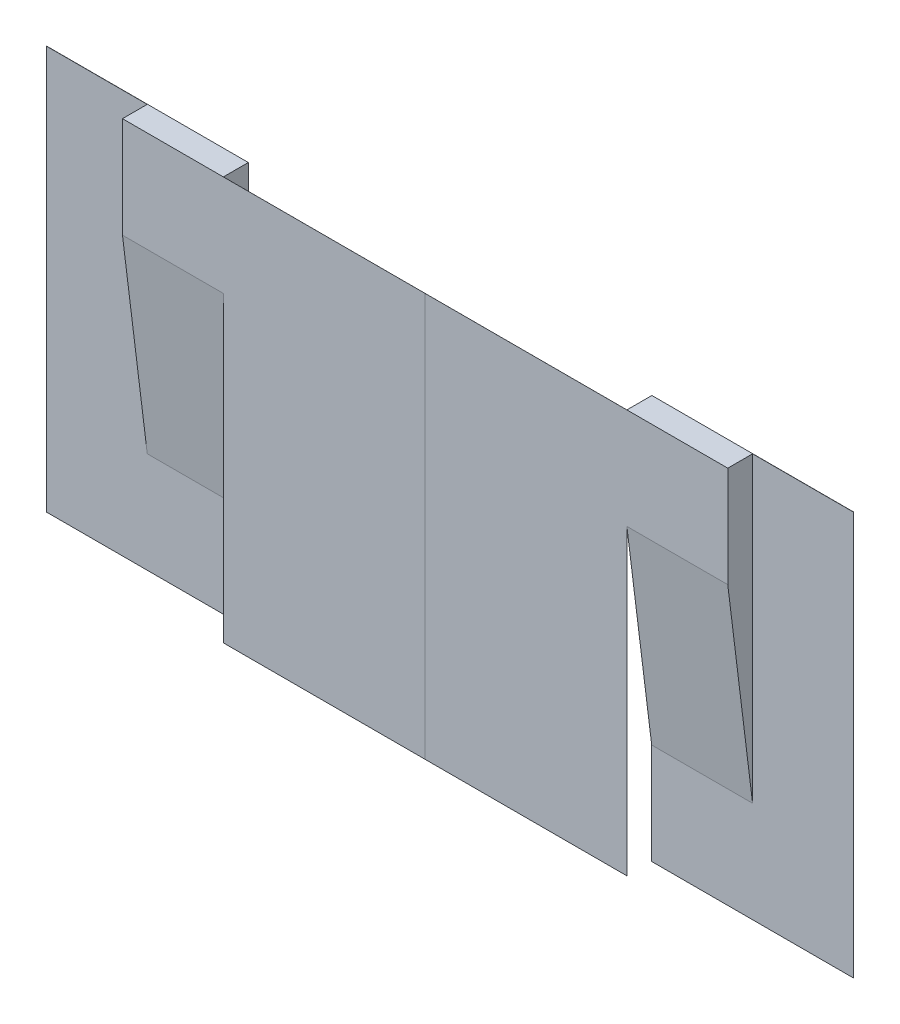
ISO-10303-21;
HEADER;
FILE_DESCRIPTION(('STEP AP214'),'2;1');
FILE_NAME('part.step','',(''),(''),'','','');
FILE_SCHEMA(('AUTOMOTIVE_DESIGN { 1 0 10303 214 1 1 1 1 }'));
ENDSEC;
DATA;
#1=APPLICATION_CONTEXT('core data for automotive mechanical design processes');
#2=APPLICATION_PROTOCOL_DEFINITION('international standard','automotive_design',2000,#1);
#3=PRODUCT_CONTEXT('',#1,'mechanical');
#4=PRODUCT('Part','Part','',(#3));
#5=PRODUCT_RELATED_PRODUCT_CATEGORY('part','',(#4));
#6=PRODUCT_DEFINITION_FORMATION('','',#4);
#7=PRODUCT_DEFINITION_CONTEXT('part definition',#1,'design');
#8=PRODUCT_DEFINITION('design','',#6,#7);
#9=PRODUCT_DEFINITION_SHAPE('','',#8);
#10=(LENGTH_UNIT() NAMED_UNIT(*) SI_UNIT(.MILLI.,.METRE.));
#11=(NAMED_UNIT(*) PLANE_ANGLE_UNIT() SI_UNIT($,.RADIAN.));
#12=(NAMED_UNIT(*) SI_UNIT($,.STERADIAN.) SOLID_ANGLE_UNIT());
#13=UNCERTAINTY_MEASURE_WITH_UNIT(LENGTH_MEASURE(1.E-05),#10,'distance_accuracy_value','');
#14=(GEOMETRIC_REPRESENTATION_CONTEXT(3) GLOBAL_UNCERTAINTY_ASSIGNED_CONTEXT((#13)) GLOBAL_UNIT_ASSIGNED_CONTEXT((#10,
#11,#12)) REPRESENTATION_CONTEXT('',''));
#15=CARTESIAN_POINT('',(0.,0.,0.));
#16=DIRECTION('',(0.,0.,1.));
#17=DIRECTION('',(1.,0.,0.));
#18=AXIS2_PLACEMENT_3D('',#15,#16,#17);
#19=CARTESIAN_POINT('',(-305.,-376.820483207703,-349.609273672104));
#20=DIRECTION('',(1.,0.,0.));
#21=DIRECTION('',(0.,1.,0.));
#22=AXIS2_PLACEMENT_3D('',#19,#20,#21);
#23=PLANE('',#22);
#24=DIRECTION('',(0.,-1.,0.));
#25=VECTOR('',#24,1.);
#26=CARTESIAN_POINT('',(-305.,-376.820483207703,-274.709273672104));
#27=LINE('',#26,#25);
#28=CARTESIAN_POINT('',(-305.,538.179516792297,-274.709273672104));
#29=VERTEX_POINT('',#28);
#30=CARTESIAN_POINT('',(-305.,-72.6338165410332,-274.709273672104));
#31=VERTEX_POINT('',#30);
#32=EDGE_CURVE('E21',#29,#31,#27,.T.);
#33=ORIENTED_EDGE('',*,*,#32,.F.);
#34=DIRECTION('',(0.,0.,1.));
#35=VECTOR('',#34,1.);
#36=CARTESIAN_POINT('',(-305.,538.179516792297,-349.609273672104));
#37=LINE('',#36,#35);
#38=CARTESIAN_POINT('',(-305.,538.179516792297,-425.609273672104));
#39=VERTEX_POINT('',#38);
#40=EDGE_CURVE('E339',#39,#29,#37,.T.);
#41=ORIENTED_EDGE('',*,*,#40,.F.);
#42=DIRECTION('',(0.,1.,0.));
#43=VECTOR('',#42,1.);
#44=CARTESIAN_POINT('',(-305.,-376.820483207703,-425.609273672104));
#45=LINE('',#44,#43);
#46=CARTESIAN_POINT('',(-305.,-1901.82048320771,-425.609273672104));
#47=VERTEX_POINT('',#46);
#48=EDGE_CURVE('E295',#47,#39,#45,.T.);
#49=ORIENTED_EDGE('',*,*,#48,.F.);
#50=DIRECTION('',(0.,0.,1.));
#51=VECTOR('',#50,1.);
#52=CARTESIAN_POINT('',(-305.,-1901.82048320771,-425.609273672104));
#53=LINE('',#52,#51);
#54=CARTESIAN_POINT('',(-305.,-1901.82048320771,-424.609273672104));
#55=VERTEX_POINT('',#54);
#56=EDGE_CURVE('E326',#47,#55,#53,.T.);
#57=ORIENTED_EDGE('',*,*,#56,.T.);
#58=DIRECTION('',(0.,1.,0.));
#59=VECTOR('',#58,1.);
#60=CARTESIAN_POINT('',(-305.,-376.820483207703,-424.609273672104));
#61=LINE('',#60,#59);
#62=CARTESIAN_POINT('',(-305.,-1291.8204832077,-424.609273672104));
#63=VERTEX_POINT('',#62);
#64=EDGE_CURVE('E294',#55,#63,#61,.T.);
#65=ORIENTED_EDGE('',*,*,#64,.T.);
#66=DIRECTION('',(0.,-0.992526177814719,-0.122031907108367));
#67=VECTOR('',#66,1.);
#68=CARTESIAN_POINT('',(-305.,-681.820483207701,-349.609273672104));
#69=LINE('',#68,#67);
#70=EDGE_CURVE('E329',#31,#63,#69,.T.);
#71=ORIENTED_EDGE('',*,*,#70,.F.);
#72=EDGE_LOOP('',(#33,#41,#49,#57,#65,#71));
#73=FACE_BOUND('',#72,.T.);
#74=ADVANCED_FACE('F17',(#73),#23,.F.);
#75=CARTESIAN_POINT('',(305.,-681.820483207701,-349.609273672104));
#76=DIRECTION('',(0.,0.122031907108367,-0.992526177814719));
#77=DIRECTION('',(0.,0.992526177814719,0.122031907108367));
#78=AXIS2_PLACEMENT_3D('',#75,#76,#77);
#79=PLANE('',#78);
#80=CARTESIAN_POINT('',(-305.,-71.8204832077005,-274.609273672104));
#81=VERTEX_POINT('',#80);
#82=EDGE_CURVE('E347',#81,#31,#69,.T.);
#83=ORIENTED_EDGE('',*,*,#82,.T.);
#84=ORIENTED_EDGE('',*,*,#70,.T.);
#85=DIRECTION('',(-1.,0.,0.));
#86=VECTOR('',#85,1.);
#87=CARTESIAN_POINT('',(305.,-1291.8204832077,-424.609273672104));
#88=LINE('',#87,#86);
#89=CARTESIAN_POINT('',(305.,-1291.8204832077,-424.609273672104));
#90=VERTEX_POINT('',#89);
#91=EDGE_CURVE('E358',#90,#63,#88,.T.);
#92=ORIENTED_EDGE('',*,*,#91,.F.);
#93=DIRECTION('',(0.,-0.992526177814719,-0.122031907108367));
#94=VECTOR('',#93,1.);
#95=CARTESIAN_POINT('',(305.,-681.820483207701,-349.609273672104));
#96=LINE('',#95,#94);
#97=CARTESIAN_POINT('',(305.,-71.8204832077005,-274.609273672104));
#98=VERTEX_POINT('',#97);
#99=EDGE_CURVE('E335',#98,#90,#96,.T.);
#100=ORIENTED_EDGE('',*,*,#99,.F.);
#101=DIRECTION('',(-1.,0.,0.));
#102=VECTOR('',#101,1.);
#103=CARTESIAN_POINT('',(305.,-71.8204832077005,-274.609273672104));
#104=LINE('',#103,#102);
#105=EDGE_CURVE('E346',#98,#81,#104,.T.);
#106=ORIENTED_EDGE('',*,*,#105,.T.);
#107=EDGE_LOOP('',(#83,#84,#92,#100,#106));
#108=FACE_BOUND('',#107,.T.);
#109=ADVANCED_FACE('F19',(#108),#79,.F.);
#110=CARTESIAN_POINT('',(305.,538.179516792297,-349.609273672104));
#111=DIRECTION('',(0.,-1.,0.));
#112=DIRECTION('',(0.,0.,-1.));
#113=AXIS2_PLACEMENT_3D('',#110,#111,#112);
#114=PLANE('',#113);
#115=ORIENTED_EDGE('',*,*,#40,.T.);
#116=DIRECTION('',(-1.,0.,0.));
#117=VECTOR('',#116,1.);
#118=CARTESIAN_POINT('',(-915.,538.179516792297,-274.709273672104));
#119=LINE('',#118,#117);
#120=CARTESIAN_POINT('',(-1525.,538.179516792298,-274.709273672104));
#121=VERTEX_POINT('',#120);
#122=EDGE_CURVE('E258',#29,#121,#119,.T.);
#123=ORIENTED_EDGE('',*,*,#122,.T.);
#124=DIRECTION('',(0.,0.,1.));
#125=VECTOR('',#124,1.);
#126=CARTESIAN_POINT('',(-1525.,538.179516792298,-274.709273672104));
#127=LINE('',#126,#125);
#128=CARTESIAN_POINT('',(-1525.,538.179516792298,-274.609273672104));
#129=VERTEX_POINT('',#128);
#130=EDGE_CURVE('E290',#121,#129,#127,.T.);
#131=ORIENTED_EDGE('',*,*,#130,.T.);
#132=DIRECTION('',(-1.,0.,0.));
#133=VECTOR('',#132,1.);
#134=CARTESIAN_POINT('',(305.,538.179516792297,-274.609273672104));
#135=LINE('',#134,#133);
#136=CARTESIAN_POINT('',(305.,538.179516792297,-274.609273672104));
#137=VERTEX_POINT('',#136);
#138=EDGE_CURVE('E356',#137,#129,#135,.T.);
#139=ORIENTED_EDGE('',*,*,#138,.F.);
#140=DIRECTION('',(0.,0.,1.));
#141=VECTOR('',#140,1.);
#142=CARTESIAN_POINT('',(305.,538.179516792297,-349.609273672104));
#143=LINE('',#142,#141);
#144=CARTESIAN_POINT('',(305.,538.179516792297,-424.609273672104));
#145=VERTEX_POINT('',#144);
#146=EDGE_CURVE('E45',#145,#137,#143,.T.);
#147=ORIENTED_EDGE('',*,*,#146,.F.);
#148=DIRECTION('',(-1.,0.,0.));
#149=VECTOR('',#148,1.);
#150=CARTESIAN_POINT('',(305.,538.179516792297,-424.609273672104));
#151=LINE('',#150,#149);
#152=CARTESIAN_POINT('',(915.,538.179516792297,-424.609273672104));
#153=VERTEX_POINT('',#152);
#154=EDGE_CURVE('E315',#153,#145,#151,.T.);
#155=ORIENTED_EDGE('',*,*,#154,.F.);
#156=DIRECTION('',(0.,0.,1.));
#157=VECTOR('',#156,1.);
#158=CARTESIAN_POINT('',(915.,538.179516792297,-425.609273672104));
#159=LINE('',#158,#157);
#160=CARTESIAN_POINT('',(915.,538.179516792297,-425.609273672104));
#161=VERTEX_POINT('',#160);
#162=EDGE_CURVE('E330',#161,#153,#159,.T.);
#163=ORIENTED_EDGE('',*,*,#162,.F.);
#164=DIRECTION('',(-1.,0.,0.));
#165=VECTOR('',#164,1.);
#166=CARTESIAN_POINT('',(305.,538.179516792297,-425.609273672104));
#167=LINE('',#166,#165);
#168=EDGE_CURVE('E299',#161,#39,#167,.T.);
#169=ORIENTED_EDGE('',*,*,#168,.T.);
#170=EDGE_LOOP('',(#115,#123,#131,#139,#147,#155,#163,#169));
#171=FACE_BOUND('',#170,.T.);
#172=ADVANCED_FACE('F392',(#171),#114,.F.);
#173=CARTESIAN_POINT('',(305.,233.179516792298,-274.609273672104));
#174=DIRECTION('',(0.,0.,-1.));
#175=DIRECTION('',(0.,1.,0.));
#176=AXIS2_PLACEMENT_3D('',#173,#174,#175);
#177=PLANE('',#176);
#178=DIRECTION('',(0.,-1.,0.));
#179=VECTOR('',#178,1.);
#180=CARTESIAN_POINT('',(-305.,-822.701977826655,-274.609273672104));
#181=LINE('',#180,#179);
#182=CARTESIAN_POINT('',(-305.,-1901.8204832077,-274.609273672104));
#183=VERTEX_POINT('',#182);
#184=EDGE_CURVE('E263',#81,#183,#181,.T.);
#185=ORIENTED_EDGE('',*,*,#184,.F.);
#186=ORIENTED_EDGE('',*,*,#105,.F.);
#187=DIRECTION('',(0.,-1.,0.));
#188=VECTOR('',#187,1.);
#189=CARTESIAN_POINT('',(305.,233.179516792298,-274.609273672104));
#190=LINE('',#189,#188);
#191=EDGE_CURVE('E39',#137,#98,#190,.T.);
#192=ORIENTED_EDGE('',*,*,#191,.F.);
#193=ORIENTED_EDGE('',*,*,#138,.T.);
#194=DIRECTION('',(0.,-1.,0.));
#195=VECTOR('',#194,1.);
#196=CARTESIAN_POINT('',(-1525.,-681.820483207702,-274.609273672104));
#197=LINE('',#196,#195);
#198=CARTESIAN_POINT('',(-1525.,-1901.8204832077,-274.609273672104));
#199=VERTEX_POINT('',#198);
#200=EDGE_CURVE('E251',#129,#199,#197,.T.);
#201=ORIENTED_EDGE('',*,*,#200,.T.);
#202=DIRECTION('',(-1.,0.,0.));
#203=VECTOR('',#202,1.);
#204=CARTESIAN_POINT('',(-915.,-1901.8204832077,-274.609273672104));
#205=LINE('',#204,#203);
#206=EDGE_CURVE('E278',#183,#199,#205,.T.);
#207=ORIENTED_EDGE('',*,*,#206,.F.);
#208=EDGE_LOOP('',(#185,#186,#192,#193,#201,#207));
#209=FACE_BOUND('',#208,.T.);
#210=ADVANCED_FACE('F384',(#209),#177,.F.);
#211=CARTESIAN_POINT('',(305.,-376.820483207703,-349.609273672104));
#212=DIRECTION('',(1.,0.,0.));
#213=DIRECTION('',(0.,1.,0.));
#214=AXIS2_PLACEMENT_3D('',#211,#212,#213);
#215=PLANE('',#214);
#216=ORIENTED_EDGE('',*,*,#99,.T.);
#217=DIRECTION('',(0.,1.,0.));
#218=VECTOR('',#217,1.);
#219=CARTESIAN_POINT('',(305.,-376.820483207703,-424.609273672104));
#220=LINE('',#219,#218);
#221=EDGE_CURVE('E338',#90,#145,#220,.T.);
#222=ORIENTED_EDGE('',*,*,#221,.T.);
#223=ORIENTED_EDGE('',*,*,#146,.T.);
#224=ORIENTED_EDGE('',*,*,#191,.T.);
#225=EDGE_LOOP('',(#216,#222,#223,#224));
#226=FACE_BOUND('',#225,.T.);
#227=ADVANCED_FACE('F416',(#226),#215,.T.);
#228=CARTESIAN_POINT('',(305.,-1901.82048320771,-425.609273672104));
#229=DIRECTION('',(0.,-1.,0.));
#230=DIRECTION('',(0.,0.,-1.));
#231=AXIS2_PLACEMENT_3D('',#228,#229,#230);
#232=PLANE('',#231);
#233=DIRECTION('',(1.,0.,0.));
#234=VECTOR('',#233,1.);
#235=CARTESIAN_POINT('',(305.,-1901.82048320771,-424.609273672104));
#236=LINE('',#235,#234);
#237=CARTESIAN_POINT('',(915.,-1901.82048320771,-424.609273672104));
#238=VERTEX_POINT('',#237);
#239=EDGE_CURVE('E300',#55,#238,#236,.T.);
#240=ORIENTED_EDGE('',*,*,#239,.F.);
#241=ORIENTED_EDGE('',*,*,#56,.F.);
#242=DIRECTION('',(1.,0.,0.));
#243=VECTOR('',#242,1.);
#244=CARTESIAN_POINT('',(305.,-1901.82048320771,-425.609273672104));
#245=LINE('',#244,#243);
#246=CARTESIAN_POINT('',(915.,-1901.82048320771,-425.609273672104));
#247=VERTEX_POINT('',#246);
#248=EDGE_CURVE('E307',#47,#247,#245,.T.);
#249=ORIENTED_EDGE('',*,*,#248,.T.);
#250=DIRECTION('',(0.,0.,1.));
#251=VECTOR('',#250,1.);
#252=CARTESIAN_POINT('',(915.,-1901.82048320771,-425.609273672104));
#253=LINE('',#252,#251);
#254=EDGE_CURVE('E311',#247,#238,#253,.T.);
#255=ORIENTED_EDGE('',*,*,#254,.T.);
#256=EDGE_LOOP('',(#240,#241,#249,#255));
#257=FACE_BOUND('',#256,.T.);
#258=ADVANCED_FACE('F402',(#257),#232,.T.);
#259=CARTESIAN_POINT('',(915.,-681.820483207703,-425.609273672104));
#260=DIRECTION('',(-1.,0.,0.));
#261=DIRECTION('',(0.,0.,1.));
#262=AXIS2_PLACEMENT_3D('',#259,#260,#261);
#263=PLANE('',#262);
#264=DIRECTION('',(0.,-1.,0.));
#265=VECTOR('',#264,1.);
#266=CARTESIAN_POINT('',(915.,-681.820483207703,-424.609273672104));
#267=LINE('',#266,#265);
#268=EDGE_CURVE('E319',#153,#238,#267,.T.);
#269=ORIENTED_EDGE('',*,*,#268,.T.);
#270=ORIENTED_EDGE('',*,*,#254,.F.);
#271=DIRECTION('',(0.,-1.,0.));
#272=VECTOR('',#271,1.);
#273=CARTESIAN_POINT('',(915.,-681.820483207703,-425.609273672104));
#274=LINE('',#273,#272);
#275=EDGE_CURVE('E304',#161,#247,#274,.T.);
#276=ORIENTED_EDGE('',*,*,#275,.F.);
#277=ORIENTED_EDGE('',*,*,#162,.T.);
#278=EDGE_LOOP('',(#269,#270,#276,#277));
#279=FACE_BOUND('',#278,.T.);
#280=ADVANCED_FACE('F407',(#279),#263,.F.);
#281=CARTESIAN_POINT('',(305.,-681.820483207703,-425.609273672104));
#282=DIRECTION('',(0.,0.,-1.));
#283=DIRECTION('',(1.,0.,0.));
#284=AXIS2_PLACEMENT_3D('',#281,#282,#283);
#285=PLANE('',#284);
#286=ORIENTED_EDGE('',*,*,#248,.F.);
#287=ORIENTED_EDGE('',*,*,#48,.T.);
#288=ORIENTED_EDGE('',*,*,#168,.F.);
#289=ORIENTED_EDGE('',*,*,#275,.T.);
#290=EDGE_LOOP('',(#286,#287,#288,#289));
#291=FACE_BOUND('',#290,.T.);
#292=ADVANCED_FACE('F397',(#291),#285,.T.);
#293=CARTESIAN_POINT('',(305.,-681.820483207703,-424.609273672104));
#294=DIRECTION('',(0.,0.,-1.));
#295=DIRECTION('',(1.,0.,0.));
#296=AXIS2_PLACEMENT_3D('',#293,#294,#295);
#297=PLANE('',#296);
#298=ORIENTED_EDGE('',*,*,#221,.F.);
#299=ORIENTED_EDGE('',*,*,#91,.T.);
#300=ORIENTED_EDGE('',*,*,#64,.F.);
#301=ORIENTED_EDGE('',*,*,#239,.T.);
#302=ORIENTED_EDGE('',*,*,#268,.F.);
#303=ORIENTED_EDGE('',*,*,#154,.T.);
#304=EDGE_LOOP('',(#298,#299,#300,#301,#302,#303));
#305=FACE_BOUND('',#304,.T.);
#306=ADVANCED_FACE('F403',(#305),#297,.F.);
#307=CARTESIAN_POINT('',(-610.,-681.820483207702,-274.709273672104));
#308=DIRECTION('',(0.,0.,1.));
#309=DIRECTION('',(1.,0.,0.));
#310=AXIS2_PLACEMENT_3D('',#307,#308,#309);
#311=PLANE('',#310);
#312=ORIENTED_EDGE('',*,*,#122,.F.);
#313=ORIENTED_EDGE('',*,*,#32,.T.);
#314=DIRECTION('',(0.,-1.,0.));
#315=VECTOR('',#314,1.);
#316=CARTESIAN_POINT('',(-305.,-822.701977826655,-274.709273672104));
#317=LINE('',#316,#315);
#318=CARTESIAN_POINT('',(-305.,-1901.8204832077,-274.709273672104));
#319=VERTEX_POINT('',#318);
#320=EDGE_CURVE('E271',#31,#319,#317,.T.);
#321=ORIENTED_EDGE('',*,*,#320,.T.);
#322=DIRECTION('',(-1.,0.,0.));
#323=VECTOR('',#322,1.);
#324=CARTESIAN_POINT('',(-915.,-1901.8204832077,-274.709273672104));
#325=LINE('',#324,#323);
#326=CARTESIAN_POINT('',(-1525.,-1901.8204832077,-274.709273672104));
#327=VERTEX_POINT('',#326);
#328=EDGE_CURVE('E267',#319,#327,#325,.T.);
#329=ORIENTED_EDGE('',*,*,#328,.T.);
#330=DIRECTION('',(0.,-1.,0.));
#331=VECTOR('',#330,1.);
#332=CARTESIAN_POINT('',(-1525.,-681.820483207702,-274.709273672104));
#333=LINE('',#332,#331);
#334=EDGE_CURVE('E262',#121,#327,#333,.T.);
#335=ORIENTED_EDGE('',*,*,#334,.F.);
#336=EDGE_LOOP('',(#312,#313,#321,#329,#335));
#337=FACE_BOUND('',#336,.T.);
#338=ADVANCED_FACE('F371',(#337),#311,.F.);
#339=CARTESIAN_POINT('',(-1525.,-681.820483207702,-274.709273672104));
#340=DIRECTION('',(-1.,0.,0.));
#341=DIRECTION('',(0.,0.,1.));
#342=AXIS2_PLACEMENT_3D('',#339,#340,#341);
#343=PLANE('',#342);
#344=CARTESIAN_POINT('',(-1525.,470.467478036881,-274.65957403183));
#345=DIRECTION('',(-1.,0.,0.));
#346=DIRECTION('',(0.,0.,1.));
#347=AXIS2_PLACEMENT_3D('',#344,#345,#346);
#348=CIRCLE('',#347,0.0392794722128831);
#349=CARTESIAN_POINT('',(-1525.,470.467478036881,-274.620294559617));
#350=VERTEX_POINT('',#349);
#351=EDGE_CURVE('E11',#350,#350,#348,.T.);
#352=ORIENTED_EDGE('',*,*,#351,.F.);
#353=EDGE_LOOP('',(#352));
#354=FACE_BOUND('',#353,.T.);
#355=ORIENTED_EDGE('',*,*,#200,.F.);
#356=ORIENTED_EDGE('',*,*,#130,.F.);
#357=ORIENTED_EDGE('',*,*,#334,.T.);
#358=DIRECTION('',(0.,0.,1.));
#359=VECTOR('',#358,1.);
#360=CARTESIAN_POINT('',(-1525.,-1901.8204832077,-274.709273672104));
#361=LINE('',#360,#359);
#362=EDGE_CURVE('E287',#327,#199,#361,.T.);
#363=ORIENTED_EDGE('',*,*,#362,.T.);
#364=EDGE_LOOP('',(#355,#356,#357,#363));
#365=FACE_BOUND('',#364,.T.);
#366=ADVANCED_FACE('F390',(#354,#365),#343,.T.);
#367=CARTESIAN_POINT('',(-915.,-1901.8204832077,-274.709273672104));
#368=DIRECTION('',(0.,1.,0.));
#369=DIRECTION('',(0.,0.,1.));
#370=AXIS2_PLACEMENT_3D('',#367,#368,#369);
#371=PLANE('',#370);
#372=ORIENTED_EDGE('',*,*,#206,.T.);
#373=ORIENTED_EDGE('',*,*,#362,.F.);
#374=ORIENTED_EDGE('',*,*,#328,.F.);
#375=DIRECTION('',(0.,0.,1.));
#376=VECTOR('',#375,1.);
#377=CARTESIAN_POINT('',(-305.,-1901.8204832077,-274.709273672104));
#378=LINE('',#377,#376);
#379=EDGE_CURVE('E274',#319,#183,#378,.T.);
#380=ORIENTED_EDGE('',*,*,#379,.T.);
#381=EDGE_LOOP('',(#372,#373,#374,#380));
#382=FACE_BOUND('',#381,.T.);
#383=ADVANCED_FACE('F387',(#382),#371,.F.);
#384=CARTESIAN_POINT('',(-305.,-822.701977826655,-274.709273672104));
#385=DIRECTION('',(-1.,0.,0.));
#386=DIRECTION('',(0.,0.,1.));
#387=AXIS2_PLACEMENT_3D('',#384,#385,#386);
#388=PLANE('',#387);
#389=ORIENTED_EDGE('',*,*,#82,.F.);
#390=ORIENTED_EDGE('',*,*,#184,.T.);
#391=ORIENTED_EDGE('',*,*,#379,.F.);
#392=ORIENTED_EDGE('',*,*,#320,.F.);
#393=EDGE_LOOP('',(#389,#390,#391,#392));
#394=FACE_BOUND('',#393,.T.);
#395=ADVANCED_FACE('F377',(#394),#388,.F.);
#396=CARTESIAN_POINT('',(-1525.1,470.467478036881,-274.65957403183));
#397=DIRECTION('',(1.,0.,0.));
#398=DIRECTION('',(0.,0.,-1.));
#399=AXIS2_PLACEMENT_3D('',#396,#397,#398);
#400=CYLINDRICAL_SURFACE('',#399,0.0392794722128831);
#401=ORIENTED_EDGE('',*,*,#351,.T.);
#402=EDGE_LOOP('',(#401));
#403=FACE_BOUND('',#402,.T.);
#404=CARTESIAN_POINT('',(-1525.2,470.467478036881,-274.65957403183));
#405=DIRECTION('',(-1.,0.,0.));
#406=DIRECTION('',(0.,0.,1.));
#407=AXIS2_PLACEMENT_3D('',#404,#405,#406);
#408=CIRCLE('',#407,0.0392794722128831);
#409=CARTESIAN_POINT('',(-1525.2,470.467478036881,-274.620294559617));
#410=VERTEX_POINT('',#409);
#411=EDGE_CURVE('E243',#410,#410,#408,.T.);
#412=ORIENTED_EDGE('',*,*,#411,.F.);
#413=EDGE_LOOP('',(#412));
#414=FACE_BOUND('',#413,.T.);
#415=ADVANCED_FACE('F512',(#403,#414),#400,.T.);
#416=CARTESIAN_POINT('',(-2745.2,-376.820483207703,-349.609273672104));
#417=DIRECTION('',(-1.,0.,0.));
#418=DIRECTION('',(0.,1.,0.));
#419=AXIS2_PLACEMENT_3D('',#416,#417,#418);
#420=PLANE('',#419);
#421=DIRECTION('',(0.,-1.,0.));
#422=VECTOR('',#421,1.);
#423=CARTESIAN_POINT('',(-2745.2,-376.820483207703,-274.709273672104));
#424=LINE('',#423,#422);
#425=CARTESIAN_POINT('',(-2745.2,538.179516792297,-274.709273672104));
#426=VERTEX_POINT('',#425);
#427=CARTESIAN_POINT('',(-2745.2,-72.6338165410332,-274.709273672104));
#428=VERTEX_POINT('',#427);
#429=EDGE_CURVE('E229',#426,#428,#424,.T.);
#430=ORIENTED_EDGE('',*,*,#429,.T.);
#431=DIRECTION('',(0.,-0.992526177814719,-0.122031907108367));
#432=VECTOR('',#431,1.);
#433=CARTESIAN_POINT('',(-2745.2,-681.820483207701,-349.609273672104));
#434=LINE('',#433,#432);
#435=CARTESIAN_POINT('',(-2745.2,-1291.8204832077,-424.609273672104));
#436=VERTEX_POINT('',#435);
#437=EDGE_CURVE('E747',#428,#436,#434,.T.);
#438=ORIENTED_EDGE('',*,*,#437,.T.);
#439=DIRECTION('',(0.,1.,0.));
#440=VECTOR('',#439,1.);
#441=CARTESIAN_POINT('',(-2745.2,-376.820483207703,-424.609273672104));
#442=LINE('',#441,#440);
#443=CARTESIAN_POINT('',(-2745.2,-1901.82048320771,-424.609273672104));
#444=VERTEX_POINT('',#443);
#445=EDGE_CURVE('E785',#444,#436,#442,.T.);
#446=ORIENTED_EDGE('',*,*,#445,.F.);
#447=DIRECTION('',(0.,0.,1.));
#448=VECTOR('',#447,1.);
#449=CARTESIAN_POINT('',(-2745.2,-1901.82048320771,-425.609273672104));
#450=LINE('',#449,#448);
#451=CARTESIAN_POINT('',(-2745.2,-1901.82048320771,-425.609273672104));
#452=VERTEX_POINT('',#451);
#453=EDGE_CURVE('E753',#452,#444,#450,.T.);
#454=ORIENTED_EDGE('',*,*,#453,.F.);
#455=DIRECTION('',(0.,1.,0.));
#456=VECTOR('',#455,1.);
#457=CARTESIAN_POINT('',(-2745.2,-376.820483207703,-425.609273672104));
#458=LINE('',#457,#456);
#459=CARTESIAN_POINT('',(-2745.2,538.179516792297,-425.609273672104));
#460=VERTEX_POINT('',#459);
#461=EDGE_CURVE('E232',#452,#460,#458,.T.);
#462=ORIENTED_EDGE('',*,*,#461,.T.);
#463=DIRECTION('',(0.,0.,1.));
#464=VECTOR('',#463,1.);
#465=CARTESIAN_POINT('',(-2745.2,538.179516792297,-349.609273672104));
#466=LINE('',#465,#464);
#467=EDGE_CURVE('E213',#460,#426,#466,.T.);
#468=ORIENTED_EDGE('',*,*,#467,.T.);
#469=EDGE_LOOP('',(#430,#438,#446,#454,#462,#468));
#470=FACE_BOUND('',#469,.T.);
#471=ADVANCED_FACE('F227',(#470),#420,.F.);
#472=CARTESIAN_POINT('',(-3355.2,-681.820483207701,-349.609273672104));
#473=DIRECTION('',(0.,0.122031907108367,-0.992526177814719));
#474=DIRECTION('',(0.,0.992526177814719,0.122031907108367));
#475=AXIS2_PLACEMENT_3D('',#472,#473,#474);
#476=PLANE('',#475);
#477=CARTESIAN_POINT('',(-2745.2,-71.8204832077005,-274.609273672104));
#478=VERTEX_POINT('',#477);
#479=EDGE_CURVE('E235',#478,#428,#434,.T.);
#480=ORIENTED_EDGE('',*,*,#479,.F.);
#481=DIRECTION('',(1.,0.,0.));
#482=VECTOR('',#481,1.);
#483=CARTESIAN_POINT('',(-3355.2,-71.8204832077005,-274.609273672104));
#484=LINE('',#483,#482);
#485=CARTESIAN_POINT('',(-3355.2,-71.8204832077005,-274.609273672104));
#486=VERTEX_POINT('',#485);
#487=EDGE_CURVE('E764',#486,#478,#484,.T.);
#488=ORIENTED_EDGE('',*,*,#487,.F.);
#489=DIRECTION('',(0.,-0.992526177814719,-0.122031907108367));
#490=VECTOR('',#489,1.);
#491=CARTESIAN_POINT('',(-3355.2,-681.820483207701,-349.609273672104));
#492=LINE('',#491,#490);
#493=CARTESIAN_POINT('',(-3355.2,-1291.8204832077,-424.609273672104));
#494=VERTEX_POINT('',#493);
#495=EDGE_CURVE('E234',#486,#494,#492,.T.);
#496=ORIENTED_EDGE('',*,*,#495,.T.);
#497=DIRECTION('',(1.,0.,0.));
#498=VECTOR('',#497,1.);
#499=CARTESIAN_POINT('',(-3355.2,-1291.8204832077,-424.609273672104));
#500=LINE('',#499,#498);
#501=EDGE_CURVE('E244',#494,#436,#500,.T.);
#502=ORIENTED_EDGE('',*,*,#501,.T.);
#503=ORIENTED_EDGE('',*,*,#437,.F.);
#504=EDGE_LOOP('',(#480,#488,#496,#502,#503));
#505=FACE_BOUND('',#504,.T.);
#506=ADVANCED_FACE('F532',(#505),#476,.F.);
#507=CARTESIAN_POINT('',(-3355.2,538.179516792297,-349.609273672104));
#508=DIRECTION('',(0.,-1.,0.));
#509=DIRECTION('',(0.,0.,-1.));
#510=AXIS2_PLACEMENT_3D('',#507,#508,#509);
#511=PLANE('',#510);
#512=ORIENTED_EDGE('',*,*,#467,.F.);
#513=DIRECTION('',(1.,0.,0.));
#514=VECTOR('',#513,1.);
#515=CARTESIAN_POINT('',(-3355.2,538.179516792297,-425.609273672104));
#516=LINE('',#515,#514);
#517=CARTESIAN_POINT('',(-3965.2,538.179516792297,-425.609273672104));
#518=VERTEX_POINT('',#517);
#519=EDGE_CURVE('E799',#518,#460,#516,.T.);
#520=ORIENTED_EDGE('',*,*,#519,.F.);
#521=DIRECTION('',(0.,0.,1.));
#522=VECTOR('',#521,1.);
#523=CARTESIAN_POINT('',(-3965.2,538.179516792297,-425.609273672104));
#524=LINE('',#523,#522);
#525=CARTESIAN_POINT('',(-3965.2,538.179516792297,-424.609273672104));
#526=VERTEX_POINT('',#525);
#527=EDGE_CURVE('E758',#518,#526,#524,.T.);
#528=ORIENTED_EDGE('',*,*,#527,.T.);
#529=DIRECTION('',(1.,0.,0.));
#530=VECTOR('',#529,1.);
#531=CARTESIAN_POINT('',(-3355.2,538.179516792297,-424.609273672104));
#532=LINE('',#531,#530);
#533=CARTESIAN_POINT('',(-3355.2,538.179516792297,-424.609273672104));
#534=VERTEX_POINT('',#533);
#535=EDGE_CURVE('E791',#526,#534,#532,.T.);
#536=ORIENTED_EDGE('',*,*,#535,.T.);
#537=DIRECTION('',(0.,0.,1.));
#538=VECTOR('',#537,1.);
#539=CARTESIAN_POINT('',(-3355.2,538.179516792297,-349.609273672104));
#540=LINE('',#539,#538);
#541=CARTESIAN_POINT('',(-3355.2,538.179516792297,-274.609273672104));
#542=VERTEX_POINT('',#541);
#543=EDGE_CURVE('E774',#534,#542,#540,.T.);
#544=ORIENTED_EDGE('',*,*,#543,.T.);
#545=DIRECTION('',(1.,0.,0.));
#546=VECTOR('',#545,1.);
#547=CARTESIAN_POINT('',(-3355.2,538.179516792297,-274.609273672104));
#548=LINE('',#547,#546);
#549=CARTESIAN_POINT('',(-1525.2,538.179516792298,-274.609273672104));
#550=VERTEX_POINT('',#549);
#551=EDGE_CURVE('E254',#542,#550,#548,.T.);
#552=ORIENTED_EDGE('',*,*,#551,.T.);
#553=DIRECTION('',(0.,0.,1.));
#554=VECTOR('',#553,1.);
#555=CARTESIAN_POINT('',(-1525.2,538.179516792298,-274.709273672104));
#556=LINE('',#555,#554);
#557=CARTESIAN_POINT('',(-1525.2,538.179516792298,-274.709273672104));
#558=VERTEX_POINT('',#557);
#559=EDGE_CURVE('E217',#558,#550,#556,.T.);
#560=ORIENTED_EDGE('',*,*,#559,.F.);
#561=DIRECTION('',(1.,0.,0.));
#562=VECTOR('',#561,1.);
#563=CARTESIAN_POINT('',(-2135.2,538.179516792297,-274.709273672104));
#564=LINE('',#563,#562);
#565=EDGE_CURVE('E209',#426,#558,#564,.T.);
#566=ORIENTED_EDGE('',*,*,#565,.F.);
#567=EDGE_LOOP('',(#512,#520,#528,#536,#544,#552,#560,#566));
#568=FACE_BOUND('',#567,.T.);
#569=ADVANCED_FACE('F211',(#568),#511,.F.);
#570=CARTESIAN_POINT('',(-3355.2,233.179516792298,-274.609273672104));
#571=DIRECTION('',(0.,0.,-1.));
#572=DIRECTION('',(0.,1.,0.));
#573=AXIS2_PLACEMENT_3D('',#570,#571,#572);
#574=PLANE('',#573);
#575=DIRECTION('',(0.,-1.,0.));
#576=VECTOR('',#575,1.);
#577=CARTESIAN_POINT('',(-2745.2,-822.701977826655,-274.609273672104));
#578=LINE('',#577,#576);
#579=CARTESIAN_POINT('',(-2745.2,-1901.8204832077,-274.609273672104));
#580=VERTEX_POINT('',#579);
#581=EDGE_CURVE('E223',#478,#580,#578,.T.);
#582=ORIENTED_EDGE('',*,*,#581,.T.);
#583=DIRECTION('',(1.,0.,0.));
#584=VECTOR('',#583,1.);
#585=CARTESIAN_POINT('',(-2135.2,-1901.8204832077,-274.609273672104));
#586=LINE('',#585,#584);
#587=CARTESIAN_POINT('',(-1525.2,-1901.8204832077,-274.609273672104));
#588=VERTEX_POINT('',#587);
#589=EDGE_CURVE('E780',#580,#588,#586,.T.);
#590=ORIENTED_EDGE('',*,*,#589,.T.);
#591=DIRECTION('',(0.,-1.,0.));
#592=VECTOR('',#591,1.);
#593=CARTESIAN_POINT('',(-1525.2,-681.820483207702,-274.609273672104));
#594=LINE('',#593,#592);
#595=EDGE_CURVE('E778',#550,#588,#594,.T.);
#596=ORIENTED_EDGE('',*,*,#595,.F.);
#597=ORIENTED_EDGE('',*,*,#551,.F.);
#598=DIRECTION('',(0.,-1.,0.));
#599=VECTOR('',#598,1.);
#600=CARTESIAN_POINT('',(-3355.2,233.179516792298,-274.609273672104));
#601=LINE('',#600,#599);
#602=EDGE_CURVE('E761',#542,#486,#601,.T.);
#603=ORIENTED_EDGE('',*,*,#602,.T.);
#604=ORIENTED_EDGE('',*,*,#487,.T.);
#605=EDGE_LOOP('',(#582,#590,#596,#597,#603,#604));
#606=FACE_BOUND('',#605,.T.);
#607=ADVANCED_FACE('F552',(#606),#574,.F.);
#608=CARTESIAN_POINT('',(-3355.2,-376.820483207703,-349.609273672104));
#609=DIRECTION('',(-1.,0.,0.));
#610=DIRECTION('',(0.,1.,0.));
#611=AXIS2_PLACEMENT_3D('',#608,#609,#610);
#612=PLANE('',#611);
#613=ORIENTED_EDGE('',*,*,#495,.F.);
#614=ORIENTED_EDGE('',*,*,#602,.F.);
#615=ORIENTED_EDGE('',*,*,#543,.F.);
#616=DIRECTION('',(0.,1.,0.));
#617=VECTOR('',#616,1.);
#618=CARTESIAN_POINT('',(-3355.2,-376.820483207703,-424.609273672104));
#619=LINE('',#618,#617);
#620=EDGE_CURVE('E827',#494,#534,#619,.T.);
#621=ORIENTED_EDGE('',*,*,#620,.F.);
#622=EDGE_LOOP('',(#613,#614,#615,#621));
#623=FACE_BOUND('',#622,.T.);
#624=ADVANCED_FACE('F562',(#623),#612,.T.);
#625=CARTESIAN_POINT('',(-3355.2,-1901.82048320771,-425.609273672104));
#626=DIRECTION('',(0.,-1.,0.));
#627=DIRECTION('',(0.,0.,-1.));
#628=AXIS2_PLACEMENT_3D('',#625,#626,#627);
#629=PLANE('',#628);
#630=DIRECTION('',(-1.,0.,0.));
#631=VECTOR('',#630,1.);
#632=CARTESIAN_POINT('',(-3355.2,-1901.82048320771,-424.609273672104));
#633=LINE('',#632,#631);
#634=CARTESIAN_POINT('',(-3965.2,-1901.82048320771,-424.609273672104));
#635=VERTEX_POINT('',#634);
#636=EDGE_CURVE('E800',#444,#635,#633,.T.);
#637=ORIENTED_EDGE('',*,*,#636,.T.);
#638=DIRECTION('',(0.,0.,1.));
#639=VECTOR('',#638,1.);
#640=CARTESIAN_POINT('',(-3965.2,-1901.82048320771,-425.609273672104));
#641=LINE('',#640,#639);
#642=CARTESIAN_POINT('',(-3965.2,-1901.82048320771,-425.609273672104));
#643=VERTEX_POINT('',#642);
#644=EDGE_CURVE('E809',#643,#635,#641,.T.);
#645=ORIENTED_EDGE('',*,*,#644,.F.);
#646=DIRECTION('',(-1.,0.,0.));
#647=VECTOR('',#646,1.);
#648=CARTESIAN_POINT('',(-3355.2,-1901.82048320771,-425.609273672104));
#649=LINE('',#648,#647);
#650=EDGE_CURVE('E806',#452,#643,#649,.T.);
#651=ORIENTED_EDGE('',*,*,#650,.F.);
#652=ORIENTED_EDGE('',*,*,#453,.T.);
#653=EDGE_LOOP('',(#637,#645,#651,#652));
#654=FACE_BOUND('',#653,.T.);
#655=ADVANCED_FACE('F573',(#654),#629,.T.);
#656=CARTESIAN_POINT('',(-3965.2,-681.820483207703,-425.609273672104));
#657=DIRECTION('',(1.,0.,0.));
#658=DIRECTION('',(0.,0.,1.));
#659=AXIS2_PLACEMENT_3D('',#656,#657,#658);
#660=PLANE('',#659);
#661=DIRECTION('',(0.,-1.,0.));
#662=VECTOR('',#661,1.);
#663=CARTESIAN_POINT('',(-3965.2,-681.820483207703,-424.609273672104));
#664=LINE('',#663,#662);
#665=EDGE_CURVE('E813',#526,#635,#664,.T.);
#666=ORIENTED_EDGE('',*,*,#665,.F.);
#667=ORIENTED_EDGE('',*,*,#527,.F.);
#668=DIRECTION('',(0.,-1.,0.));
#669=VECTOR('',#668,1.);
#670=CARTESIAN_POINT('',(-3965.2,-681.820483207703,-425.609273672104));
#671=LINE('',#670,#669);
#672=EDGE_CURVE('E803',#518,#643,#671,.T.);
#673=ORIENTED_EDGE('',*,*,#672,.T.);
#674=ORIENTED_EDGE('',*,*,#644,.T.);
#675=EDGE_LOOP('',(#666,#667,#673,#674));
#676=FACE_BOUND('',#675,.T.);
#677=ADVANCED_FACE('F584',(#676),#660,.F.);
#678=CARTESIAN_POINT('',(-3355.2,-681.820483207703,-425.609273672104));
#679=DIRECTION('',(0.,0.,-1.));
#680=DIRECTION('',(-1.,0.,0.));
#681=AXIS2_PLACEMENT_3D('',#678,#679,#680);
#682=PLANE('',#681);
#683=ORIENTED_EDGE('',*,*,#650,.T.);
#684=ORIENTED_EDGE('',*,*,#672,.F.);
#685=ORIENTED_EDGE('',*,*,#519,.T.);
#686=ORIENTED_EDGE('',*,*,#461,.F.);
#687=EDGE_LOOP('',(#683,#684,#685,#686));
#688=FACE_BOUND('',#687,.T.);
#689=ADVANCED_FACE('F595',(#688),#682,.T.);
#690=CARTESIAN_POINT('',(-3355.2,-681.820483207703,-424.609273672104));
#691=DIRECTION('',(0.,0.,-1.));
#692=DIRECTION('',(-1.,0.,0.));
#693=AXIS2_PLACEMENT_3D('',#690,#691,#692);
#694=PLANE('',#693);
#695=ORIENTED_EDGE('',*,*,#620,.T.);
#696=ORIENTED_EDGE('',*,*,#535,.F.);
#697=ORIENTED_EDGE('',*,*,#665,.T.);
#698=ORIENTED_EDGE('',*,*,#636,.F.);
#699=ORIENTED_EDGE('',*,*,#445,.T.);
#700=ORIENTED_EDGE('',*,*,#501,.F.);
#701=EDGE_LOOP('',(#695,#696,#697,#698,#699,#700));
#702=FACE_BOUND('',#701,.T.);
#703=ADVANCED_FACE('F606',(#702),#694,.F.);
#704=CARTESIAN_POINT('',(-2440.2,-681.820483207702,-274.709273672104));
#705=DIRECTION('',(0.,0.,1.));
#706=DIRECTION('',(-1.,0.,0.));
#707=AXIS2_PLACEMENT_3D('',#704,#705,#706);
#708=PLANE('',#707);
#709=ORIENTED_EDGE('',*,*,#565,.T.);
#710=DIRECTION('',(0.,-1.,0.));
#711=VECTOR('',#710,1.);
#712=CARTESIAN_POINT('',(-1525.2,-681.820483207702,-274.709273672104));
#713=LINE('',#712,#711);
#714=CARTESIAN_POINT('',(-1525.2,-1901.8204832077,-274.709273672104));
#715=VERTEX_POINT('',#714);
#716=EDGE_CURVE('E222',#558,#715,#713,.T.);
#717=ORIENTED_EDGE('',*,*,#716,.T.);
#718=DIRECTION('',(1.,0.,0.));
#719=VECTOR('',#718,1.);
#720=CARTESIAN_POINT('',(-2135.2,-1901.8204832077,-274.709273672104));
#721=LINE('',#720,#719);
#722=CARTESIAN_POINT('',(-2745.2,-1901.8204832077,-274.709273672104));
#723=VERTEX_POINT('',#722);
#724=EDGE_CURVE('E847',#723,#715,#721,.T.);
#725=ORIENTED_EDGE('',*,*,#724,.F.);
#726=DIRECTION('',(0.,-1.,0.));
#727=VECTOR('',#726,1.);
#728=CARTESIAN_POINT('',(-2745.2,-822.701977826655,-274.709273672104));
#729=LINE('',#728,#727);
#730=EDGE_CURVE('E240',#428,#723,#729,.T.);
#731=ORIENTED_EDGE('',*,*,#730,.F.);
#732=ORIENTED_EDGE('',*,*,#429,.F.);
#733=EDGE_LOOP('',(#709,#717,#725,#731,#732));
#734=FACE_BOUND('',#733,.T.);
#735=ADVANCED_FACE('F237',(#734),#708,.F.);
#736=CARTESIAN_POINT('',(-1525.2,-681.820483207702,-274.709273672104));
#737=DIRECTION('',(1.,0.,0.));
#738=DIRECTION('',(0.,0.,1.));
#739=AXIS2_PLACEMENT_3D('',#736,#737,#738);
#740=PLANE('',#739);
#741=ORIENTED_EDGE('',*,*,#411,.T.);
#742=EDGE_LOOP('',(#741));
#743=FACE_BOUND('',#742,.T.);
#744=ORIENTED_EDGE('',*,*,#595,.T.);
#745=DIRECTION('',(0.,0.,1.));
#746=VECTOR('',#745,1.);
#747=CARTESIAN_POINT('',(-1525.2,-1901.8204832077,-274.709273672104));
#748=LINE('',#747,#746);
#749=EDGE_CURVE('E786',#715,#588,#748,.T.);
#750=ORIENTED_EDGE('',*,*,#749,.F.);
#751=ORIENTED_EDGE('',*,*,#716,.F.);
#752=ORIENTED_EDGE('',*,*,#559,.T.);
#753=EDGE_LOOP('',(#744,#750,#751,#752));
#754=FACE_BOUND('',#753,.T.);
#755=ADVANCED_FACE('F627',(#743,#754),#740,.T.);
#756=CARTESIAN_POINT('',(-2135.2,-1901.8204832077,-274.709273672104));
#757=DIRECTION('',(0.,1.,0.));
#758=DIRECTION('',(0.,0.,1.));
#759=AXIS2_PLACEMENT_3D('',#756,#757,#758);
#760=PLANE('',#759);
#761=ORIENTED_EDGE('',*,*,#589,.F.);
#762=DIRECTION('',(0.,0.,1.));
#763=VECTOR('',#762,1.);
#764=CARTESIAN_POINT('',(-2745.2,-1901.8204832077,-274.709273672104));
#765=LINE('',#764,#763);
#766=EDGE_CURVE('E794',#723,#580,#765,.T.);
#767=ORIENTED_EDGE('',*,*,#766,.F.);
#768=ORIENTED_EDGE('',*,*,#724,.T.);
#769=ORIENTED_EDGE('',*,*,#749,.T.);
#770=EDGE_LOOP('',(#761,#767,#768,#769));
#771=FACE_BOUND('',#770,.T.);
#772=ADVANCED_FACE('F637',(#771),#760,.F.);
#773=CARTESIAN_POINT('',(-2745.2,-822.701977826655,-274.709273672104));
#774=DIRECTION('',(1.,0.,0.));
#775=DIRECTION('',(0.,0.,1.));
#776=AXIS2_PLACEMENT_3D('',#773,#774,#775);
#777=PLANE('',#776);
#778=ORIENTED_EDGE('',*,*,#479,.T.);
#779=ORIENTED_EDGE('',*,*,#730,.T.);
#780=ORIENTED_EDGE('',*,*,#766,.T.);
#781=ORIENTED_EDGE('',*,*,#581,.F.);
#782=EDGE_LOOP('',(#778,#779,#780,#781));
#783=FACE_BOUND('',#782,.T.);
#784=ADVANCED_FACE('F648',(#783),#777,.F.);
#785=CLOSED_SHELL('',(#74,#109,#172,#210,#227,#258,#280,#292,#306,#338,#366,#383,#395,#415,#471,
#506,#569,#607,#624,#655,#677,#689,#703,#735,#755,#772,#784));
#786=MANIFOLD_SOLID_BREP('B1',#785);
#787=ADVANCED_BREP_SHAPE_REPRESENTATION('',(#18,#786),#14);
#788=SHAPE_DEFINITION_REPRESENTATION(#9,#787);
ENDSEC;
END-ISO-10303-21;
